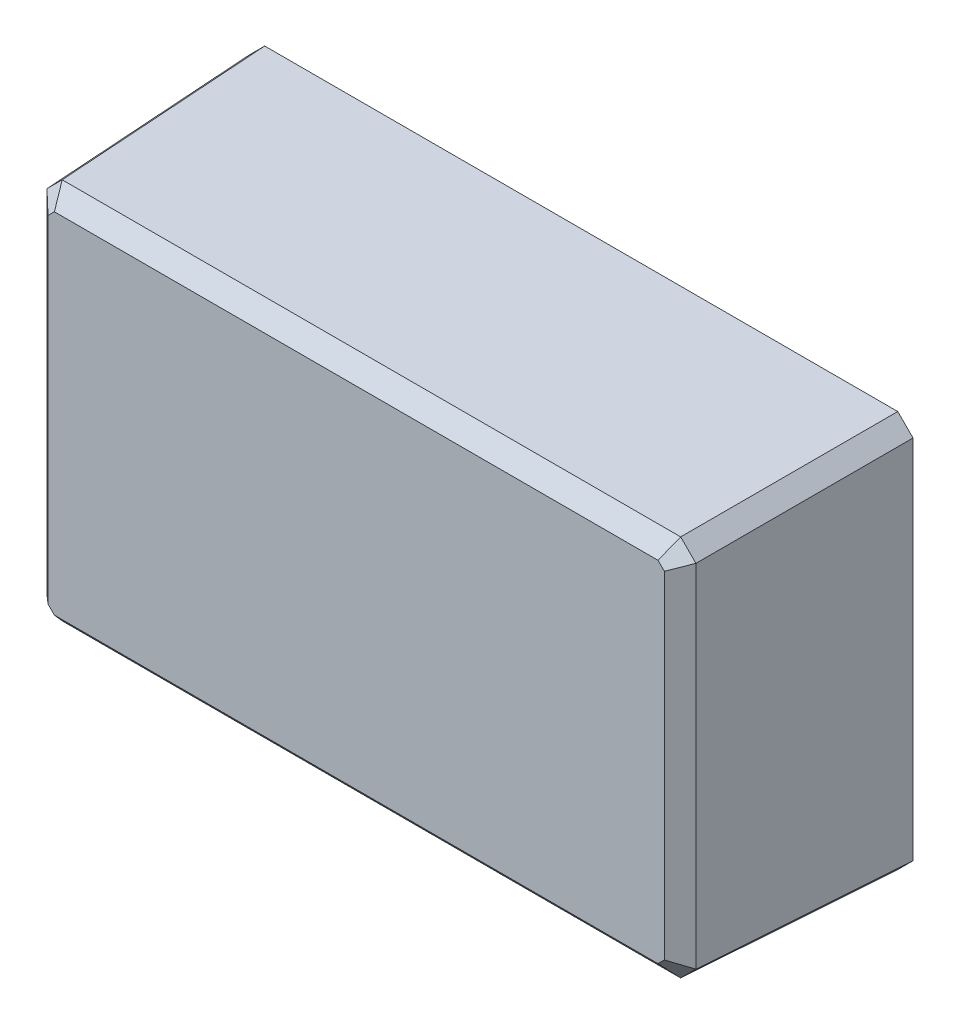
ISO-10303-21;
HEADER;
FILE_DESCRIPTION(('STEP AP214'),'2;1');
FILE_NAME('part.step','',(''),(''),'','','');
FILE_SCHEMA(('AUTOMOTIVE_DESIGN { 1 0 10303 214 1 1 1 1 }'));
ENDSEC;
DATA;
#1=APPLICATION_CONTEXT('core data for automotive mechanical design processes');
#2=APPLICATION_PROTOCOL_DEFINITION('international standard','automotive_design',2000,#1);
#3=PRODUCT_CONTEXT('',#1,'mechanical');
#4=PRODUCT('Part','Part','',(#3));
#5=PRODUCT_RELATED_PRODUCT_CATEGORY('part','',(#4));
#6=PRODUCT_DEFINITION_FORMATION('','',#4);
#7=PRODUCT_DEFINITION_CONTEXT('part definition',#1,'design');
#8=PRODUCT_DEFINITION('design','',#6,#7);
#9=PRODUCT_DEFINITION_SHAPE('','',#8);
#10=(LENGTH_UNIT() NAMED_UNIT(*) SI_UNIT(.MILLI.,.METRE.));
#11=(NAMED_UNIT(*) PLANE_ANGLE_UNIT() SI_UNIT($,.RADIAN.));
#12=(NAMED_UNIT(*) SI_UNIT($,.STERADIAN.) SOLID_ANGLE_UNIT());
#13=UNCERTAINTY_MEASURE_WITH_UNIT(LENGTH_MEASURE(1.E-05),#10,'distance_accuracy_value','');
#14=(GEOMETRIC_REPRESENTATION_CONTEXT(3) GLOBAL_UNCERTAINTY_ASSIGNED_CONTEXT((#13)) GLOBAL_UNIT_ASSIGNED_CONTEXT((#10,
#11,#12)) REPRESENTATION_CONTEXT('',''));
#15=CARTESIAN_POINT('',(0.,0.,0.));
#16=DIRECTION('',(0.,0.,1.));
#17=DIRECTION('',(1.,0.,0.));
#18=AXIS2_PLACEMENT_3D('',#15,#16,#17);
#19=CARTESIAN_POINT('',(43.5,26.,0.));
#20=DIRECTION('',(0.999390827019096,0.,0.034899496702501));
#21=DIRECTION('',(0.034899496702501,0.,-0.999390827019096));
#22=AXIS2_PLACEMENT_3D('',#19,#20,#21);
#23=PLANE('',#22);
#24=DIRECTION('',(0.0348782627423747,0.0348782627423747,-0.998782765958718));
#25=VECTOR('',#24,1.);
#26=CARTESIAN_POINT('',(43.5024344676311,24.0012168634011,-0.0697140316941828));
#27=LINE('',#26,#25);
#28=CARTESIAN_POINT('',(43.5,23.9987823957699,0.));
#29=VERTEX_POINT('',#28);
#30=CARTESIAN_POINT('',(42.5396362933984,23.0384186891684,27.5012183459618));
#31=VERTEX_POINT('',#30);
#32=EDGE_CURVE('E164',#29,#31,#27,.F.);
#33=ORIENTED_EDGE('',*,*,#32,.T.);
#34=DIRECTION('',(0.,1.,0.));
#35=VECTOR('',#34,1.);
#36=CARTESIAN_POINT('',(42.5396362933984,-22.9661778026697,27.5012183459618));
#37=LINE('',#36,#35);
#38=CARTESIAN_POINT('',(42.5396362933984,-23.0359767960747,27.5012183459618));
#39=VERTEX_POINT('',#38);
#40=EDGE_CURVE('E159',#31,#39,#37,.F.);
#41=ORIENTED_EDGE('',*,*,#40,.T.);
#42=DIRECTION('',(-0.0348782627423747,0.0348782627423747,0.998782765958718));
#43=VECTOR('',#42,1.);
#44=CARTESIAN_POINT('',(43.4391797911573,-23.9355202938336,1.74166290513802));
#45=LINE('',#44,#43);
#46=CARTESIAN_POINT('',(43.5,-23.9963405026763,0.));
#47=VERTEX_POINT('',#46);
#48=EDGE_CURVE('E152',#39,#47,#45,.F.);
#49=ORIENTED_EDGE('',*,*,#48,.T.);
#50=DIRECTION('',(0.,1.,0.));
#51=VECTOR('',#50,1.);
#52=CARTESIAN_POINT('',(43.5,26.,0.));
#53=LINE('',#52,#51);
#54=EDGE_CURVE('E156',#47,#29,#53,.T.);
#55=ORIENTED_EDGE('',*,*,#54,.T.);
#56=EDGE_LOOP('',(#33,#41,#49,#55));
#57=FACE_BOUND('',#56,.T.);
#58=ADVANCED_FACE('F39',(#57),#23,.T.);
#59=CARTESIAN_POINT('',(-43.5,26.,0.));
#60=DIRECTION('',(0.,0.999390827019096,0.034899496702501));
#61=DIRECTION('',(0.,-0.034899496702501,0.999390827019096));
#62=AXIS2_PLACEMENT_3D('',#59,#60,#61);
#63=PLANE('',#62);
#64=DIRECTION('',(-0.0348782627423747,0.0348782627423747,-0.998782765958718));
#65=VECTOR('',#64,1.);
#66=CARTESIAN_POINT('',(-41.5012168634011,26.0024344676311,-0.0697140316941815));
#67=LINE('',#66,#65);
#68=CARTESIAN_POINT('',(-41.49878239577,26.,0.));
#69=VERTEX_POINT('',#68);
#70=CARTESIAN_POINT('',(-40.5384186891684,25.0396362933984,27.5012183459618));
#71=VERTEX_POINT('',#70);
#72=EDGE_CURVE('E217',#69,#71,#67,.F.);
#73=ORIENTED_EDGE('',*,*,#72,.T.);
#74=DIRECTION('',(-1.,0.,0.));
#75=VECTOR('',#74,1.);
#76=CARTESIAN_POINT('',(40.4661778026696,25.0396362933984,27.5012183459618));
#77=LINE('',#76,#75);
#78=CARTESIAN_POINT('',(40.5359767960747,25.0396362933984,27.5012183459618));
#79=VERTEX_POINT('',#78);
#80=EDGE_CURVE('E298',#71,#79,#77,.F.);
#81=ORIENTED_EDGE('',*,*,#80,.T.);
#82=DIRECTION('',(-0.0348782627423747,-0.0348782627423747,0.998782765958718));
#83=VECTOR('',#82,1.);
#84=CARTESIAN_POINT('',(41.3929430314162,25.8966025287399,2.96091617581626));
#85=LINE('',#84,#83);
#86=CARTESIAN_POINT('',(41.4963405026762,26.,0.));
#87=VERTEX_POINT('',#86);
#88=EDGE_CURVE('E221',#79,#87,#85,.F.);
#89=ORIENTED_EDGE('',*,*,#88,.T.);
#90=DIRECTION('',(-1.,0.,0.));
#91=VECTOR('',#90,1.);
#92=CARTESIAN_POINT('',(-43.5,26.,0.));
#93=LINE('',#92,#91);
#94=EDGE_CURVE('E182',#87,#69,#93,.T.);
#95=ORIENTED_EDGE('',*,*,#94,.T.);
#96=EDGE_LOOP('',(#73,#81,#89,#95));
#97=FACE_BOUND('',#96,.T.);
#98=ADVANCED_FACE('F368',(#97),#63,.T.);
#99=CARTESIAN_POINT('',(-43.5,26.,0.));
#100=DIRECTION('',(-0.999390827019096,0.,0.034899496702501));
#101=DIRECTION('',(0.034899496702501,0.,0.999390827019096));
#102=AXIS2_PLACEMENT_3D('',#99,#100,#101);
#103=PLANE('',#102);
#104=DIRECTION('',(-0.0348782627423747,-0.0348782627423747,-0.998782765958718));
#105=VECTOR('',#104,1.);
#106=CARTESIAN_POINT('',(-43.439176820611,-23.9379592163809,1.74174797045634));
#107=LINE('',#106,#105);
#108=CARTESIAN_POINT('',(-43.5,-23.9987823957699,0.));
#109=VERTEX_POINT('',#108);
#110=CARTESIAN_POINT('',(-42.5396362933984,-23.0384186891684,27.5012183459618));
#111=VERTEX_POINT('',#110);
#112=EDGE_CURVE('E227',#109,#111,#107,.F.);
#113=ORIENTED_EDGE('',*,*,#112,.T.);
#114=DIRECTION('',(0.,-1.,0.));
#115=VECTOR('',#114,1.);
#116=CARTESIAN_POINT('',(-42.5396362933985,22.9661778026697,27.5012183459618));
#117=LINE('',#116,#115);
#118=CARTESIAN_POINT('',(-42.5396362933985,23.0359767960748,27.5012183459618));
#119=VERTEX_POINT('',#118);
#120=EDGE_CURVE('E274',#111,#119,#117,.F.);
#121=ORIENTED_EDGE('',*,*,#120,.T.);
#122=DIRECTION('',(0.0348782627423747,-0.0348782627423747,0.998782765958718));
#123=VECTOR('',#122,1.);
#124=CARTESIAN_POINT('',(-43.5024374381775,23.9987779408538,-0.0697990970124979));
#125=LINE('',#124,#123);
#126=CARTESIAN_POINT('',(-43.5,23.9963405026763,0.));
#127=VERTEX_POINT('',#126);
#128=EDGE_CURVE('E224',#119,#127,#125,.F.);
#129=ORIENTED_EDGE('',*,*,#128,.T.);
#130=DIRECTION('',(0.,-1.,0.));
#131=VECTOR('',#130,1.);
#132=CARTESIAN_POINT('',(-43.5,26.,0.));
#133=LINE('',#132,#131);
#134=EDGE_CURVE('E188',#127,#109,#133,.T.);
#135=ORIENTED_EDGE('',*,*,#134,.T.);
#136=EDGE_LOOP('',(#113,#121,#129,#135));
#137=FACE_BOUND('',#136,.T.);
#138=ADVANCED_FACE('F373',(#137),#103,.T.);
#139=CARTESIAN_POINT('',(-43.5,-26.,0.));
#140=DIRECTION('',(0.,-0.999390827019096,0.034899496702501));
#141=DIRECTION('',(0.,-0.034899496702501,-0.999390827019096));
#142=AXIS2_PLACEMENT_3D('',#139,#140,#141);
#143=PLANE('',#142);
#144=DIRECTION('',(0.0348782627423747,-0.0348782627423747,-0.998782765958718));
#145=VECTOR('',#144,1.);
#146=CARTESIAN_POINT('',(41.3953819539635,-25.8965995581936,2.96100124113457));
#147=LINE('',#146,#145);
#148=CARTESIAN_POINT('',(41.4987823957699,-26.,0.));
#149=VERTEX_POINT('',#148);
#150=CARTESIAN_POINT('',(40.5384186891683,-25.0396362933984,27.5012183459618));
#151=VERTEX_POINT('',#150);
#152=EDGE_CURVE('E170',#149,#151,#147,.F.);
#153=ORIENTED_EDGE('',*,*,#152,.T.);
#154=DIRECTION('',(1.,0.,0.));
#155=VECTOR('',#154,1.);
#156=CARTESIAN_POINT('',(-40.4661778026697,-25.0396362933984,27.5012183459618));
#157=LINE('',#156,#155);
#158=CARTESIAN_POINT('',(-40.5359767960747,-25.0396362933984,27.5012183459618));
#159=VERTEX_POINT('',#158);
#160=EDGE_CURVE('E286',#151,#159,#157,.F.);
#161=ORIENTED_EDGE('',*,*,#160,.T.);
#162=DIRECTION('',(0.0348782627423747,0.0348782627423747,0.998782765958718));
#163=VECTOR('',#162,1.);
#164=CARTESIAN_POINT('',(-41.4987779408538,-26.0024374381775,-0.0697990970124979));
#165=LINE('',#164,#163);
#166=CARTESIAN_POINT('',(-41.4963405026763,-26.,0.));
#167=VERTEX_POINT('',#166);
#168=EDGE_CURVE('E175',#159,#167,#165,.F.);
#169=ORIENTED_EDGE('',*,*,#168,.T.);
#170=DIRECTION('',(1.,0.,0.));
#171=VECTOR('',#170,1.);
#172=CARTESIAN_POINT('',(-43.5,-26.,0.));
#173=LINE('',#172,#171);
#174=EDGE_CURVE('E201',#167,#149,#173,.T.);
#175=ORIENTED_EDGE('',*,*,#174,.T.);
#176=EDGE_LOOP('',(#153,#161,#169,#175));
#177=FACE_BOUND('',#176,.T.);
#178=ADVANCED_FACE('F377',(#177),#143,.T.);
#179=CARTESIAN_POINT('',(0.,0.,29.5));
#180=DIRECTION('',(0.,0.,1.));
#181=DIRECTION('',(1.,0.,0.));
#182=AXIS2_PLACEMENT_3D('',#179,#180,#181);
#183=PLANE('',#182);
#184=DIRECTION('',(-1.,0.,0.));
#185=VECTOR('',#184,1.);
#186=CARTESIAN_POINT('',(-40.4686196957634,22.8962053894365,29.5));
#187=LINE('',#186,#185);
#188=CARTESIAN_POINT('',(39.5615289363704,22.8962053894365,29.5));
#189=VERTEX_POINT('',#188);
#190=CARTESIAN_POINT('',(-39.562546170421,22.8962053894365,29.5));
#191=VERTEX_POINT('',#190);
#192=EDGE_CURVE('E231',#189,#191,#187,.T.);
#193=ORIENTED_EDGE('',*,*,#192,.T.);
#194=DIRECTION('',(-0.706675505718049,-0.707537793773689,0.));
#195=VECTOR('',#194,1.);
#196=CARTESIAN_POINT('',(-31.2534897239677,31.2154005771784,29.5));
#197=LINE('',#196,#195);
#198=CARTESIAN_POINT('',(-40.3962053894365,22.0615289363706,29.5));
#199=VERTEX_POINT('',#198);
#200=EDGE_CURVE('E252',#191,#199,#197,.T.);
#201=ORIENTED_EDGE('',*,*,#200,.T.);
#202=DIRECTION('',(0.,-1.,0.));
#203=VECTOR('',#202,1.);
#204=CARTESIAN_POINT('',(-40.3962053894365,-22.9686196957634,29.5));
#205=LINE('',#204,#203);
#206=CARTESIAN_POINT('',(-40.3962053894365,-22.062546170421,29.5));
#207=VERTEX_POINT('',#206);
#208=EDGE_CURVE('E249',#199,#207,#205,.T.);
#209=ORIENTED_EDGE('',*,*,#208,.T.);
#210=DIRECTION('',(0.707537793773688,-0.70667550571805,0.));
#211=VECTOR('',#210,1.);
#212=CARTESIAN_POINT('',(-31.204736814842,-31.2428129496691,29.5));
#213=LINE('',#212,#211);
#214=CARTESIAN_POINT('',(-39.5615289363705,-22.8962053894365,29.5));
#215=VERTEX_POINT('',#214);
#216=EDGE_CURVE('E246',#207,#215,#213,.T.);
#217=ORIENTED_EDGE('',*,*,#216,.T.);
#218=DIRECTION('',(1.,0.,0.));
#219=VECTOR('',#218,1.);
#220=CARTESIAN_POINT('',(40.4686196957633,-22.8962053894365,29.5));
#221=LINE('',#220,#219);
#222=CARTESIAN_POINT('',(39.5625461704209,-22.8962053894365,29.5));
#223=VERTEX_POINT('',#222);
#224=EDGE_CURVE('E243',#215,#223,#221,.T.);
#225=ORIENTED_EDGE('',*,*,#224,.T.);
#226=DIRECTION('',(0.70667550571805,0.707537793773688,0.));
#227=VECTOR('',#226,1.);
#228=CARTESIAN_POINT('',(31.2534897239676,-31.2154005771784,29.5));
#229=LINE('',#228,#227);
#230=CARTESIAN_POINT('',(40.3962053894365,-22.0615289363705,29.5));
#231=VERTEX_POINT('',#230);
#232=EDGE_CURVE('E240',#223,#231,#229,.T.);
#233=ORIENTED_EDGE('',*,*,#232,.T.);
#234=DIRECTION('',(0.,1.,0.));
#235=VECTOR('',#234,1.);
#236=CARTESIAN_POINT('',(40.3962053894365,22.9686196957634,29.5));
#237=LINE('',#236,#235);
#238=CARTESIAN_POINT('',(40.3962053894365,22.062546170421,29.5));
#239=VERTEX_POINT('',#238);
#240=EDGE_CURVE('E237',#231,#239,#237,.T.);
#241=ORIENTED_EDGE('',*,*,#240,.T.);
#242=DIRECTION('',(-0.707537793773692,0.706675505718047,0.));
#243=VECTOR('',#242,1.);
#244=CARTESIAN_POINT('',(31.2047368148418,31.2428129496692,29.5));
#245=LINE('',#244,#243);
#246=EDGE_CURVE('E234',#239,#189,#245,.T.);
#247=ORIENTED_EDGE('',*,*,#246,.T.);
#248=EDGE_LOOP('',(#193,#201,#209,#217,#225,#233,#241,#247));
#249=FACE_BOUND('',#248,.T.);
#250=ADVANCED_FACE('F342',(#249),#183,.T.);
#251=CARTESIAN_POINT('',(0.,0.,0.));
#252=DIRECTION('',(0.,0.,1.));
#253=DIRECTION('',(1.,0.,0.));
#254=AXIS2_PLACEMENT_3D('',#251,#252,#253);
#255=PLANE('',#254);
#256=CARTESIAN_POINT('',(37.8,-20.25,0.));
#257=DIRECTION('',(0.,0.,1.));
#258=DIRECTION('',(1.,0.,0.));
#259=AXIS2_PLACEMENT_3D('',#256,#257,#258);
#260=CIRCLE('',#259,0.999999999999998);
#261=CARTESIAN_POINT('',(38.8,-20.25,0.));
#262=VERTEX_POINT('',#261);
#263=EDGE_CURVE('E11',#262,#262,#260,.F.);
#264=ORIENTED_EDGE('',*,*,#263,.F.);
#265=EDGE_LOOP('',(#264));
#266=FACE_BOUND('',#265,.T.);
#267=CARTESIAN_POINT('',(37.8,-14.75,0.));
#268=DIRECTION('',(0.,0.,1.));
#269=DIRECTION('',(1.,0.,0.));
#270=AXIS2_PLACEMENT_3D('',#267,#268,#269);
#271=CIRCLE('',#270,0.999999999999998);
#272=CARTESIAN_POINT('',(38.8,-14.75,0.));
#273=VERTEX_POINT('',#272);
#274=EDGE_CURVE('E48',#273,#273,#271,.F.);
#275=ORIENTED_EDGE('',*,*,#274,.F.);
#276=EDGE_LOOP('',(#275));
#277=FACE_BOUND('',#276,.T.);
#278=CARTESIAN_POINT('',(-38.2,14.25,0.));
#279=DIRECTION('',(0.,0.,1.));
#280=DIRECTION('',(1.,0.,0.));
#281=AXIS2_PLACEMENT_3D('',#278,#279,#280);
#282=CIRCLE('',#281,0.499999999999999);
#283=CARTESIAN_POINT('',(-37.7,14.25,0.));
#284=VERTEX_POINT('',#283);
#285=EDGE_CURVE('E330',#284,#284,#282,.F.);
#286=ORIENTED_EDGE('',*,*,#285,.F.);
#287=EDGE_LOOP('',(#286));
#288=FACE_BOUND('',#287,.T.);
#289=CARTESIAN_POINT('',(-38.2,21.,0.));
#290=DIRECTION('',(0.,0.,1.));
#291=DIRECTION('',(1.,0.,0.));
#292=AXIS2_PLACEMENT_3D('',#289,#290,#291);
#293=CIRCLE('',#292,0.499999999999999);
#294=CARTESIAN_POINT('',(-37.7,21.,0.));
#295=VERTEX_POINT('',#294);
#296=EDGE_CURVE('E301',#295,#295,#293,.F.);
#297=ORIENTED_EDGE('',*,*,#296,.F.);
#298=EDGE_LOOP('',(#297));
#299=FACE_BOUND('',#298,.T.);
#300=ORIENTED_EDGE('',*,*,#54,.F.);
#301=DIRECTION('',(0.70667550571805,0.707537793773688,0.));
#302=VECTOR('',#301,1.);
#303=CARTESIAN_POINT('',(43.5000370612715,-23.9963033961824,0.));
#304=LINE('',#303,#302);
#305=EDGE_CURVE('E167',#47,#149,#304,.F.);
#306=ORIENTED_EDGE('',*,*,#305,.T.);
#307=ORIENTED_EDGE('',*,*,#174,.F.);
#308=DIRECTION('',(0.707537793773688,-0.70667550571805,0.));
#309=VECTOR('',#308,1.);
#310=CARTESIAN_POINT('',(-41.4963419897607,-25.9999985147279,0.));
#311=LINE('',#310,#309);
#312=EDGE_CURVE('E208',#167,#109,#311,.F.);
#313=ORIENTED_EDGE('',*,*,#312,.T.);
#314=ORIENTED_EDGE('',*,*,#134,.F.);
#315=DIRECTION('',(-0.706675505718049,-0.707537793773689,0.));
#316=VECTOR('',#315,1.);
#317=CARTESIAN_POINT('',(-43.4999985147279,23.9963419897607,0.));
#318=LINE('',#317,#316);
#319=EDGE_CURVE('E163',#127,#69,#318,.F.);
#320=ORIENTED_EDGE('',*,*,#319,.T.);
#321=ORIENTED_EDGE('',*,*,#94,.F.);
#322=DIRECTION('',(-0.707537793773692,0.706675505718047,0.));
#323=VECTOR('',#322,1.);
#324=CARTESIAN_POINT('',(41.4962774197354,26.0000630060606,0.));
#325=LINE('',#324,#323);
#326=EDGE_CURVE('E176',#87,#29,#325,.F.);
#327=ORIENTED_EDGE('',*,*,#326,.T.);
#328=EDGE_LOOP('',(#300,#306,#307,#313,#314,#320,#321,#327));
#329=FACE_BOUND('',#328,.T.);
#330=ADVANCED_FACE('F178',(#266,#277,#288,#299,#329),#255,.F.);
#331=CARTESIAN_POINT('',(43.4391797911573,-23.9355202938336,1.74166290513802));
#332=DIRECTION('',(-0.706676555005212,0.70581531655556,-0.0493253030557411));
#333=DIRECTION('',(0.0348782627423747,-0.0348782627423747,-0.998782765958718));
#334=AXIS2_PLACEMENT_3D('',#331,#332,#333);
#335=PLANE('',#334);
#336=DIRECTION('',(0.706675505718051,0.707537793773688,0.));
#337=VECTOR('',#336,1.);
#338=CARTESIAN_POINT('',(42.5390456557418,-23.0364831668327,27.5024344671791));
#339=LINE('',#338,#337);
#340=CARTESIAN_POINT('',(42.5383321630573,-23.0371975301236,27.5024344671791));
#341=VERTEX_POINT('',#340);
#342=CARTESIAN_POINT('',(40.539636346123,-25.0383321630574,27.5024344671791));
#343=VERTEX_POINT('',#342);
#344=EDGE_CURVE('E280',#341,#343,#339,.F.);
#345=ORIENTED_EDGE('',*,*,#344,.T.);
#346=DIRECTION('',(-0.563923783196238,-0.603971515038039,-0.563212549370394));
#347=VECTOR('',#346,1.);
#348=CARTESIAN_POINT('',(33.6554796030552,-32.4113756518495,20.6269601831314));
#349=LINE('',#348,#347);
#350=EDGE_CURVE('E283',#343,#151,#349,.T.);
#351=ORIENTED_EDGE('',*,*,#350,.T.);
#352=ORIENTED_EDGE('',*,*,#152,.F.);
#353=ORIENTED_EDGE('',*,*,#305,.F.);
#354=ORIENTED_EDGE('',*,*,#48,.F.);
#355=DIRECTION('',(-0.603486117338443,-0.564894495767046,0.562759908692744));
#356=VECTOR('',#355,1.);
#357=CARTESIAN_POINT('',(51.3089895679664,-14.8274045457506,19.3236641217564));
#358=LINE('',#357,#356);
#359=EDGE_CURVE('E277',#39,#341,#358,.T.);
#360=ORIENTED_EDGE('',*,*,#359,.T.);
#361=EDGE_LOOP('',(#345,#351,#352,#353,#354,#360));
#362=FACE_BOUND('',#361,.T.);
#363=ADVANCED_FACE('F168',(#362),#335,.F.);
#364=CARTESIAN_POINT('',(41.3929430314162,25.8966025287399,2.96091617581626));
#365=DIRECTION('',(-0.705815316555556,-0.706676555005216,-0.0493253030557411));
#366=DIRECTION('',(0.0348782627423747,0.0348782627423747,-0.998782765958718));
#367=AXIS2_PLACEMENT_3D('',#364,#365,#366);
#368=PLANE('',#367);
#369=DIRECTION('',(-0.707537793773692,0.706675505718047,0.));
#370=VECTOR('',#369,1.);
#371=CARTESIAN_POINT('',(40.5364571903858,25.0390716005308,27.5024344671791));
#372=LINE('',#371,#370);
#373=CARTESIAN_POINT('',(40.5371975301235,25.0383321630574,27.5024344671791));
#374=VERTEX_POINT('',#373);
#375=CARTESIAN_POINT('',(42.5383321630573,23.0396363461231,27.5024344671791));
#376=VERTEX_POINT('',#375);
#377=EDGE_CURVE('E55',#374,#376,#372,.F.);
#378=ORIENTED_EDGE('',*,*,#377,.T.);
#379=DIRECTION('',(0.603971515038041,-0.563923783196234,-0.563212549370396));
#380=VECTOR('',#379,1.);
#381=CARTESIAN_POINT('',(49.4955993261278,16.5436869153647,21.0146778793257));
#382=LINE('',#381,#380);
#383=EDGE_CURVE('E293',#376,#31,#382,.T.);
#384=ORIENTED_EDGE('',*,*,#383,.T.);
#385=ORIENTED_EDGE('',*,*,#32,.F.);
#386=ORIENTED_EDGE('',*,*,#326,.F.);
#387=ORIENTED_EDGE('',*,*,#88,.F.);
#388=DIRECTION('',(0.564894495767051,-0.603486117338441,0.562759908692742));
#389=VECTOR('',#388,1.);
#390=CARTESIAN_POINT('',(32.7159333224524,33.3939178604475,19.7107247508467));
#391=LINE('',#390,#389);
#392=EDGE_CURVE('E60',#79,#374,#391,.T.);
#393=ORIENTED_EDGE('',*,*,#392,.T.);
#394=EDGE_LOOP('',(#378,#384,#385,#386,#387,#393));
#395=FACE_BOUND('',#394,.T.);
#396=ADVANCED_FACE('F386',(#395),#368,.F.);
#397=CARTESIAN_POINT('',(-41.4987779408538,-26.0024374381775,-0.0697990970124979));
#398=DIRECTION('',(0.70581531655556,0.706676555005212,-0.0493253030557411));
#399=DIRECTION('',(-0.0348782627423747,-0.0348782627423747,-0.998782765958718));
#400=AXIS2_PLACEMENT_3D('',#397,#398,#399);
#401=PLANE('',#400);
#402=DIRECTION('',(0.707537793773688,-0.706675505718051,0.));
#403=VECTOR('',#402,1.);
#404=CARTESIAN_POINT('',(-40.536521760411,-25.0390071091982,27.5024344671791));
#405=LINE('',#404,#403);
#406=CARTESIAN_POINT('',(-40.5371975301236,-25.0383321630574,27.5024344671791));
#407=VERTEX_POINT('',#406);
#408=CARTESIAN_POINT('',(-42.5383321630573,-23.0396363461231,27.5024344671791));
#409=VERTEX_POINT('',#408);
#410=EDGE_CURVE('E268',#407,#409,#405,.F.);
#411=ORIENTED_EDGE('',*,*,#410,.T.);
#412=DIRECTION('',(-0.603971515038039,0.563923783196238,-0.563212549370393));
#413=VECTOR('',#412,1.);
#414=CARTESIAN_POINT('',(-50.529100478636,-15.5787144533383,20.0509224630712));
#415=LINE('',#414,#413);
#416=EDGE_CURVE('E271',#409,#111,#415,.T.);
#417=ORIENTED_EDGE('',*,*,#416,.T.);
#418=ORIENTED_EDGE('',*,*,#112,.F.);
#419=ORIENTED_EDGE('',*,*,#312,.F.);
#420=ORIENTED_EDGE('',*,*,#168,.F.);
#421=DIRECTION('',(-0.564894495767046,0.603486117338443,0.562759908692744));
#422=VECTOR('',#421,1.);
#423=CARTESIAN_POINT('',(-31.7501617917936,-34.4256675334231,18.7486026156794));
#424=LINE('',#423,#422);
#425=EDGE_CURVE('E266',#159,#407,#424,.T.);
#426=ORIENTED_EDGE('',*,*,#425,.T.);
#427=EDGE_LOOP('',(#411,#417,#418,#419,#420,#426));
#428=FACE_BOUND('',#427,.T.);
#429=ADVANCED_FACE('F389',(#428),#401,.F.);
#430=CARTESIAN_POINT('',(-43.5024374381775,23.9987779408538,-0.0697990970124979));
#431=DIRECTION('',(0.706676555005213,-0.705815316555559,-0.0493253030557411));
#432=DIRECTION('',(-0.0348782627423747,0.0348782627423747,-0.998782765958718));
#433=AXIS2_PLACEMENT_3D('',#430,#431,#432);
#434=PLANE('',#433);
#435=ORIENTED_EDGE('',*,*,#128,.F.);
#436=DIRECTION('',(0.603486117338442,0.564894495767048,0.562759908692743));
#437=VECTOR('',#436,1.);
#438=CARTESIAN_POINT('',(-51.925667533423,14.2501617917936,18.7486026156794));
#439=LINE('',#438,#437);
#440=CARTESIAN_POINT('',(-42.5383321630573,23.0371975301236,27.5024344671791));
#441=VERTEX_POINT('',#440);
#442=EDGE_CURVE('E263',#119,#441,#439,.T.);
#443=ORIENTED_EDGE('',*,*,#442,.T.);
#444=DIRECTION('',(-0.706675505718049,-0.707537793773689,0.));
#445=VECTOR('',#444,1.);
#446=CARTESIAN_POINT('',(-42.5390071091982,23.036521760411,27.5024344671791));
#447=LINE('',#446,#445);
#448=CARTESIAN_POINT('',(-40.5396363461231,25.0383321630574,27.5024344671791));
#449=VERTEX_POINT('',#448);
#450=EDGE_CURVE('E259',#441,#449,#447,.F.);
#451=ORIENTED_EDGE('',*,*,#450,.T.);
#452=DIRECTION('',(0.563923783196236,0.60397151503804,-0.563212549370395));
#453=VECTOR('',#452,1.);
#454=CARTESIAN_POINT('',(-33.0787144533383,33.029100478636,20.0509224630712));
#455=LINE('',#454,#453);
#456=EDGE_CURVE('E256',#449,#71,#455,.T.);
#457=ORIENTED_EDGE('',*,*,#456,.T.);
#458=ORIENTED_EDGE('',*,*,#72,.F.);
#459=ORIENTED_EDGE('',*,*,#319,.F.);
#460=EDGE_LOOP('',(#435,#443,#451,#457,#458,#459));
#461=FACE_BOUND('',#460,.T.);
#462=ADVANCED_FACE('F392',(#461),#434,.F.);
#463=CARTESIAN_POINT('',(31.2534897239676,-31.2154005771784,29.5));
#464=DIRECTION('',(0.475018099654393,-0.474439187210212,0.741124323335864));
#465=DIRECTION('',(-0.70667550571805,-0.707537793773688,0.));
#466=AXIS2_PLACEMENT_3D('',#463,#464,#465);
#467=PLANE('',#466);
#468=DIRECTION('',(-0.316449455372674,0.693768976199609,0.64695003660042));
#469=VECTOR('',#468,1.);
#470=CARTESIAN_POINT('',(40.5568946430808,-25.0761684456233,27.4671515628831));
#471=LINE('',#470,#469);
#472=EDGE_CURVE('E192',#343,#223,#471,.T.);
#473=ORIENTED_EDGE('',*,*,#472,.F.);
#474=ORIENTED_EDGE('',*,*,#344,.F.);
#475=DIRECTION('',(-0.693870003708463,0.316035063424999,0.647044246276539));
#476=VECTOR('',#475,1.);
#477=CARTESIAN_POINT('',(35.55839336427,-19.8580639904293,34.011332697366));
#478=LINE('',#477,#476);
#479=EDGE_CURVE('E183',#231,#341,#478,.F.);
#480=ORIENTED_EDGE('',*,*,#479,.F.);
#481=ORIENTED_EDGE('',*,*,#232,.F.);
#482=EDGE_LOOP('',(#473,#474,#480,#481));
#483=FACE_BOUND('',#482,.T.);
#484=ADVANCED_FACE('F41',(#483),#467,.T.);
#485=CARTESIAN_POINT('',(40.3962053894365,0.,29.5));
#486=DIRECTION('',(-0.6819983600625,0.,-0.731353701619169));
#487=DIRECTION('',(0.,1.,0.));
#488=AXIS2_PLACEMENT_3D('',#485,#486,#487);
#489=PLANE('',#488);
#490=ORIENTED_EDGE('',*,*,#40,.F.);
#491=ORIENTED_EDGE('',*,*,#383,.F.);
#492=DIRECTION('',(-0.69376897619961,-0.316449455372672,0.646950036600419));
#493=VECTOR('',#492,1.);
#494=CARTESIAN_POINT('',(37.9876716944653,20.9639395705763,31.7459940060315));
#495=LINE('',#494,#493);
#496=EDGE_CURVE('E320',#239,#376,#495,.F.);
#497=ORIENTED_EDGE('',*,*,#496,.F.);
#498=ORIENTED_EDGE('',*,*,#240,.F.);
#499=ORIENTED_EDGE('',*,*,#479,.T.);
#500=ORIENTED_EDGE('',*,*,#359,.F.);
#501=EDGE_LOOP('',(#490,#491,#497,#498,#499,#500));
#502=FACE_BOUND('',#501,.T.);
#503=ADVANCED_FACE('F414',(#502),#489,.F.);
#504=CARTESIAN_POINT('',(0.,-22.8962053894365,29.5));
#505=DIRECTION('',(0.,0.681998360062501,-0.731353701619169));
#506=DIRECTION('',(1.,0.,0.));
#507=AXIS2_PLACEMENT_3D('',#504,#505,#506);
#508=PLANE('',#507);
#509=ORIENTED_EDGE('',*,*,#472,.T.);
#510=ORIENTED_EDGE('',*,*,#224,.F.);
#511=DIRECTION('',(0.316035063425009,0.69387000370846,0.647044246276538));
#512=VECTOR('',#511,1.);
#513=CARTESIAN_POINT('',(-35.6101961674333,-14.2208664782324,37.589884412055));
#514=LINE('',#513,#512);
#515=EDGE_CURVE('E316',#407,#215,#514,.T.);
#516=ORIENTED_EDGE('',*,*,#515,.F.);
#517=ORIENTED_EDGE('',*,*,#425,.F.);
#518=ORIENTED_EDGE('',*,*,#160,.F.);
#519=ORIENTED_EDGE('',*,*,#350,.F.);
#520=EDGE_LOOP('',(#509,#510,#516,#517,#518,#519));
#521=FACE_BOUND('',#520,.T.);
#522=ADVANCED_FACE('F411',(#521),#508,.F.);
#523=CARTESIAN_POINT('',(31.2047368148418,31.2428129496692,29.5));
#524=DIRECTION('',(0.47443918721021,0.475018099654396,0.741124323335863));
#525=DIRECTION('',(0.707537793773692,-0.706675505718047,0.));
#526=AXIS2_PLACEMENT_3D('',#523,#524,#525);
#527=PLANE('',#526);
#528=ORIENTED_EDGE('',*,*,#496,.T.);
#529=ORIENTED_EDGE('',*,*,#377,.F.);
#530=DIRECTION('',(-0.316035063424996,-0.693870003708463,0.647044246276541));
#531=VECTOR('',#530,1.);
#532=CARTESIAN_POINT('',(35.6101961674335,14.2208664782327,37.5898844120547));
#533=LINE('',#532,#531);
#534=EDGE_CURVE('E312',#189,#374,#533,.F.);
#535=ORIENTED_EDGE('',*,*,#534,.F.);
#536=ORIENTED_EDGE('',*,*,#246,.F.);
#537=EDGE_LOOP('',(#528,#529,#535,#536));
#538=FACE_BOUND('',#537,.T.);
#539=ADVANCED_FACE('F407',(#538),#527,.T.);
#540=CARTESIAN_POINT('',(-31.204736814842,-31.2428129496691,29.5));
#541=DIRECTION('',(-0.47443918721021,-0.47501809965439,0.741124323335867));
#542=DIRECTION('',(-0.707537793773688,0.70667550571805,0.));
#543=AXIS2_PLACEMENT_3D('',#540,#541,#542);
#544=PLANE('',#543);
#545=ORIENTED_EDGE('',*,*,#515,.T.);
#546=ORIENTED_EDGE('',*,*,#216,.F.);
#547=DIRECTION('',(0.693768976199608,0.316449455372681,0.646950036600417));
#548=VECTOR('',#547,1.);
#549=CARTESIAN_POINT('',(-37.9876716944655,-20.9639395705764,31.7459940060314));
#550=LINE('',#549,#548);
#551=EDGE_CURVE('E308',#409,#207,#550,.T.);
#552=ORIENTED_EDGE('',*,*,#551,.F.);
#553=ORIENTED_EDGE('',*,*,#410,.F.);
#554=EDGE_LOOP('',(#545,#546,#552,#553));
#555=FACE_BOUND('',#554,.T.);
#556=ADVANCED_FACE('F403',(#555),#544,.T.);
#557=CARTESIAN_POINT('',(0.,22.8962053894365,29.5));
#558=DIRECTION('',(0.,-0.681998360062501,-0.731353701619169));
#559=DIRECTION('',(-1.,0.,0.));
#560=AXIS2_PLACEMENT_3D('',#557,#558,#559);
#561=PLANE('',#560);
#562=ORIENTED_EDGE('',*,*,#80,.F.);
#563=ORIENTED_EDGE('',*,*,#456,.F.);
#564=DIRECTION('',(-0.316449455372675,0.693768976199609,-0.646950036600419));
#565=VECTOR('',#564,1.);
#566=CARTESIAN_POINT('',(-35.6007425974666,14.2105326475587,37.5995208650558));
#567=LINE('',#566,#565);
#568=EDGE_CURVE('E305',#191,#449,#567,.T.);
#569=ORIENTED_EDGE('',*,*,#568,.F.);
#570=ORIENTED_EDGE('',*,*,#192,.F.);
#571=ORIENTED_EDGE('',*,*,#534,.T.);
#572=ORIENTED_EDGE('',*,*,#392,.F.);
#573=EDGE_LOOP('',(#562,#563,#569,#570,#571,#572));
#574=FACE_BOUND('',#573,.T.);
#575=ADVANCED_FACE('F399',(#574),#561,.F.);
#576=CARTESIAN_POINT('',(-40.3962053894365,0.,29.5));
#577=DIRECTION('',(0.6819983600625,0.,-0.731353701619169));
#578=DIRECTION('',(0.,-1.,0.));
#579=AXIS2_PLACEMENT_3D('',#576,#577,#578);
#580=PLANE('',#579);
#581=ORIENTED_EDGE('',*,*,#551,.T.);
#582=ORIENTED_EDGE('',*,*,#208,.F.);
#583=DIRECTION('',(0.693870003708463,-0.316035063424999,0.647044246276539));
#584=VECTOR('',#583,1.);
#585=CARTESIAN_POINT('',(-35.55839336427,19.8580639904293,34.011332697366));
#586=LINE('',#585,#584);
#587=EDGE_CURVE('E302',#441,#199,#586,.T.);
#588=ORIENTED_EDGE('',*,*,#587,.F.);
#589=ORIENTED_EDGE('',*,*,#442,.F.);
#590=ORIENTED_EDGE('',*,*,#120,.F.);
#591=ORIENTED_EDGE('',*,*,#416,.F.);
#592=EDGE_LOOP('',(#581,#582,#588,#589,#590,#591));
#593=FACE_BOUND('',#592,.T.);
#594=ADVANCED_FACE('F362',(#593),#580,.F.);
#595=CARTESIAN_POINT('',(-31.2534897239677,31.2154005771784,29.5));
#596=DIRECTION('',(-0.475018099654393,0.474439187210211,0.741124323335865));
#597=DIRECTION('',(0.706675505718049,0.707537793773689,0.));
#598=AXIS2_PLACEMENT_3D('',#595,#596,#597);
#599=PLANE('',#598);
#600=ORIENTED_EDGE('',*,*,#568,.T.);
#601=ORIENTED_EDGE('',*,*,#450,.F.);
#602=ORIENTED_EDGE('',*,*,#587,.T.);
#603=ORIENTED_EDGE('',*,*,#200,.F.);
#604=EDGE_LOOP('',(#600,#601,#602,#603));
#605=FACE_BOUND('',#604,.T.);
#606=ADVANCED_FACE('F352',(#605),#599,.T.);
#607=CARTESIAN_POINT('',(-38.2,21.,-3.5));
#608=DIRECTION('',(0.,0.,1.));
#609=DIRECTION('',(1.,0.,0.));
#610=AXIS2_PLACEMENT_3D('',#607,#608,#609);
#611=CYLINDRICAL_SURFACE('',#610,0.499999999999999);
#612=CARTESIAN_POINT('',(-38.2,21.,-3.5));
#613=DIRECTION('',(0.,0.,-1.));
#614=DIRECTION('',(-1.,0.,0.));
#615=AXIS2_PLACEMENT_3D('',#612,#613,#614);
#616=CIRCLE('',#615,0.499999999999999);
#617=CARTESIAN_POINT('',(-38.7,21.,-3.5));
#618=VERTEX_POINT('',#617);
#619=EDGE_CURVE('E195',#618,#618,#616,.T.);
#620=ORIENTED_EDGE('',*,*,#619,.F.);
#621=EDGE_LOOP('',(#620));
#622=FACE_BOUND('',#621,.T.);
#623=ORIENTED_EDGE('',*,*,#296,.T.);
#624=EDGE_LOOP('',(#623));
#625=FACE_BOUND('',#624,.T.);
#626=ADVANCED_FACE('F349',(#622,#625),#611,.T.);
#627=CARTESIAN_POINT('',(-38.2,21.,-3.5));
#628=DIRECTION('',(0.,0.,-1.));
#629=DIRECTION('',(-1.,0.,0.));
#630=AXIS2_PLACEMENT_3D('',#627,#628,#629);
#631=PLANE('',#630);
#632=ORIENTED_EDGE('',*,*,#619,.T.);
#633=EDGE_LOOP('',(#632));
#634=FACE_BOUND('',#633,.T.);
#635=ADVANCED_FACE('F351',(#634),#631,.T.);
#636=CARTESIAN_POINT('',(-38.2,14.25,-3.5));
#637=DIRECTION('',(0.,0.,1.));
#638=DIRECTION('',(1.,0.,0.));
#639=AXIS2_PLACEMENT_3D('',#636,#637,#638);
#640=CYLINDRICAL_SURFACE('',#639,0.499999999999999);
#641=CARTESIAN_POINT('',(-38.2,14.25,-3.5));
#642=DIRECTION('',(0.,0.,-1.));
#643=DIRECTION('',(-1.,0.,0.));
#644=AXIS2_PLACEMENT_3D('',#641,#642,#643);
#645=CIRCLE('',#644,0.499999999999999);
#646=CARTESIAN_POINT('',(-38.7,14.25,-3.5));
#647=VERTEX_POINT('',#646);
#648=EDGE_CURVE('E663',#647,#647,#645,.T.);
#649=ORIENTED_EDGE('',*,*,#648,.F.);
#650=EDGE_LOOP('',(#649));
#651=FACE_BOUND('',#650,.T.);
#652=ORIENTED_EDGE('',*,*,#285,.T.);
#653=EDGE_LOOP('',(#652));
#654=FACE_BOUND('',#653,.T.);
#655=ADVANCED_FACE('F359',(#651,#654),#640,.T.);
#656=CARTESIAN_POINT('',(-38.2,14.25,-3.5));
#657=DIRECTION('',(0.,0.,-1.));
#658=DIRECTION('',(-1.,0.,0.));
#659=AXIS2_PLACEMENT_3D('',#656,#657,#658);
#660=PLANE('',#659);
#661=ORIENTED_EDGE('',*,*,#648,.T.);
#662=EDGE_LOOP('',(#661));
#663=FACE_BOUND('',#662,.T.);
#664=ADVANCED_FACE('F528',(#663),#660,.T.);
#665=CARTESIAN_POINT('',(37.8,-14.75,-3.5));
#666=DIRECTION('',(0.,0.,1.));
#667=DIRECTION('',(1.,0.,0.));
#668=AXIS2_PLACEMENT_3D('',#665,#666,#667);
#669=CYLINDRICAL_SURFACE('',#668,0.999999999999998);
#670=CARTESIAN_POINT('',(37.8,-14.75,-3.5));
#671=DIRECTION('',(0.,0.,-1.));
#672=DIRECTION('',(-1.,0.,0.));
#673=AXIS2_PLACEMENT_3D('',#670,#671,#672);
#674=CIRCLE('',#673,0.999999999999998);
#675=CARTESIAN_POINT('',(36.8,-14.75,-3.5));
#676=VERTEX_POINT('',#675);
#677=EDGE_CURVE('E659',#676,#676,#674,.T.);
#678=ORIENTED_EDGE('',*,*,#677,.F.);
#679=EDGE_LOOP('',(#678));
#680=FACE_BOUND('',#679,.T.);
#681=ORIENTED_EDGE('',*,*,#274,.T.);
#682=EDGE_LOOP('',(#681));
#683=FACE_BOUND('',#682,.T.);
#684=ADVANCED_FACE('F338',(#680,#683),#669,.T.);
#685=CARTESIAN_POINT('',(37.8,-14.75,-3.5));
#686=DIRECTION('',(0.,0.,-1.));
#687=DIRECTION('',(-1.,0.,0.));
#688=AXIS2_PLACEMENT_3D('',#685,#686,#687);
#689=PLANE('',#688);
#690=ORIENTED_EDGE('',*,*,#677,.T.);
#691=EDGE_LOOP('',(#690));
#692=FACE_BOUND('',#691,.T.);
#693=ADVANCED_FACE('F545',(#692),#689,.T.);
#694=CARTESIAN_POINT('',(37.8,-20.25,-3.5));
#695=DIRECTION('',(0.,0.,1.));
#696=DIRECTION('',(1.,0.,0.));
#697=AXIS2_PLACEMENT_3D('',#694,#695,#696);
#698=CYLINDRICAL_SURFACE('',#697,0.999999999999998);
#699=CARTESIAN_POINT('',(37.8,-20.25,-3.5));
#700=DIRECTION('',(0.,0.,-1.));
#701=DIRECTION('',(-1.,0.,0.));
#702=AXIS2_PLACEMENT_3D('',#699,#700,#701);
#703=CIRCLE('',#702,0.999999999999998);
#704=CARTESIAN_POINT('',(36.8,-20.25,-3.5));
#705=VERTEX_POINT('',#704);
#706=EDGE_CURVE('E658',#705,#705,#703,.T.);
#707=ORIENTED_EDGE('',*,*,#706,.F.);
#708=EDGE_LOOP('',(#707));
#709=FACE_BOUND('',#708,.T.);
#710=ORIENTED_EDGE('',*,*,#263,.T.);
#711=EDGE_LOOP('',(#710));
#712=FACE_BOUND('',#711,.T.);
#713=ADVANCED_FACE('F554',(#709,#712),#698,.T.);
#714=CARTESIAN_POINT('',(37.8,-20.25,-3.5));
#715=DIRECTION('',(0.,0.,-1.));
#716=DIRECTION('',(-1.,0.,0.));
#717=AXIS2_PLACEMENT_3D('',#714,#715,#716);
#718=PLANE('',#717);
#719=ORIENTED_EDGE('',*,*,#706,.T.);
#720=EDGE_LOOP('',(#719));
#721=FACE_BOUND('',#720,.T.);
#722=ADVANCED_FACE('F563',(#721),#718,.T.);
#723=CLOSED_SHELL('',(#58,#98,#138,#178,#250,#330,#363,#396,#429,#462,#484,#503,#522,#539,#556,
#575,#594,#606,#626,#635,#655,#664,#684,#693,#713,#722));
#724=MANIFOLD_SOLID_BREP('B2',#723);
#725=ADVANCED_BREP_SHAPE_REPRESENTATION('',(#18,#724),#14);
#726=SHAPE_DEFINITION_REPRESENTATION(#9,#725);
ENDSEC;
END-ISO-10303-21;
